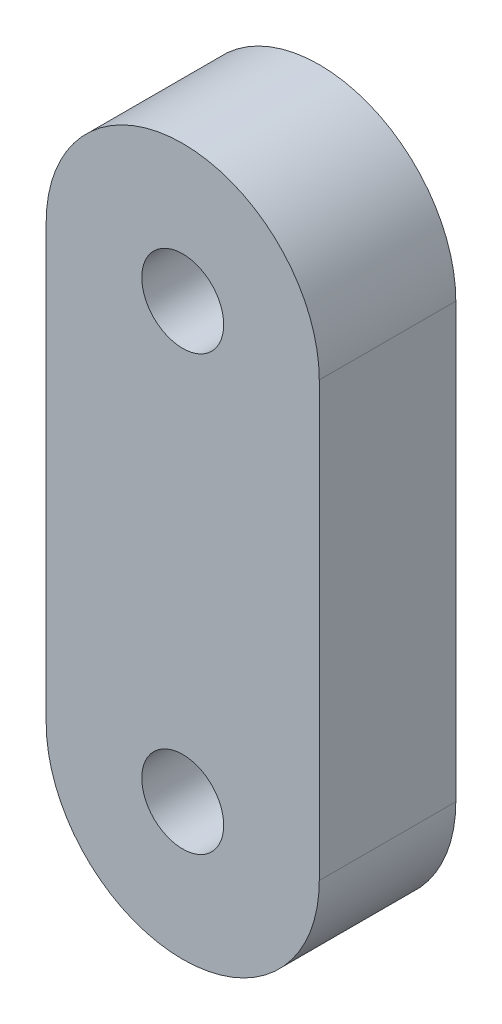
ISO-10303-21;
HEADER;
FILE_DESCRIPTION(('STEP AP214'),'2;1');
FILE_NAME('part.step','',(''),(''),'','','');
FILE_SCHEMA(('AUTOMOTIVE_DESIGN { 1 0 10303 214 1 1 1 1 }'));
ENDSEC;
DATA;
#1=APPLICATION_CONTEXT('core data for automotive mechanical design processes');
#2=APPLICATION_PROTOCOL_DEFINITION('international standard','automotive_design',2000,#1);
#3=PRODUCT_CONTEXT('',#1,'mechanical');
#4=PRODUCT('Part','Part','',(#3));
#5=PRODUCT_RELATED_PRODUCT_CATEGORY('part','',(#4));
#6=PRODUCT_DEFINITION_FORMATION('','',#4);
#7=PRODUCT_DEFINITION_CONTEXT('part definition',#1,'design');
#8=PRODUCT_DEFINITION('design','',#6,#7);
#9=PRODUCT_DEFINITION_SHAPE('','',#8);
#10=(LENGTH_UNIT() NAMED_UNIT(*) SI_UNIT(.MILLI.,.METRE.));
#11=(NAMED_UNIT(*) PLANE_ANGLE_UNIT() SI_UNIT($,.RADIAN.));
#12=(NAMED_UNIT(*) SI_UNIT($,.STERADIAN.) SOLID_ANGLE_UNIT());
#13=UNCERTAINTY_MEASURE_WITH_UNIT(LENGTH_MEASURE(1.E-05),#10,'distance_accuracy_value','');
#14=(GEOMETRIC_REPRESENTATION_CONTEXT(3) GLOBAL_UNCERTAINTY_ASSIGNED_CONTEXT((#13)) GLOBAL_UNIT_ASSIGNED_CONTEXT((#10,
#11,#12)) REPRESENTATION_CONTEXT('',''));
#15=CARTESIAN_POINT('',(0.,0.,0.));
#16=DIRECTION('',(0.,0.,1.));
#17=DIRECTION('',(1.,0.,0.));
#18=AXIS2_PLACEMENT_3D('',#15,#16,#17);
#19=CARTESIAN_POINT('',(0.,-6.35,4.));
#20=DIRECTION('',(0.,0.,1.));
#21=DIRECTION('',(1.,0.,0.));
#22=AXIS2_PLACEMENT_3D('',#19,#20,#21);
#23=PLANE('',#22);
#24=CARTESIAN_POINT('',(0.,6.35,4.));
#25=DIRECTION('',(0.,0.,1.));
#26=DIRECTION('',(1.,0.,0.));
#27=AXIS2_PLACEMENT_3D('',#24,#25,#26);
#28=CIRCLE('',#27,1.2);
#29=CARTESIAN_POINT('',(1.2,6.35,4.));
#30=VERTEX_POINT('',#29);
#31=EDGE_CURVE('E102',#30,#30,#28,.T.);
#32=ORIENTED_EDGE('',*,*,#31,.F.);
#33=EDGE_LOOP('',(#32));
#34=FACE_BOUND('',#33,.T.);
#35=CARTESIAN_POINT('',(0.,-6.35,4.));
#36=DIRECTION('',(0.,0.,1.));
#37=DIRECTION('',(1.,0.,0.));
#38=AXIS2_PLACEMENT_3D('',#35,#36,#37);
#39=CIRCLE('',#38,4.);
#40=CARTESIAN_POINT('',(-4.,-6.35,4.));
#41=VERTEX_POINT('',#40);
#42=CARTESIAN_POINT('',(4.,-6.35,4.));
#43=VERTEX_POINT('',#42);
#44=EDGE_CURVE('E87',#41,#43,#39,.T.);
#45=ORIENTED_EDGE('',*,*,#44,.T.);
#46=DIRECTION('',(0.,1.,0.));
#47=VECTOR('',#46,1.);
#48=CARTESIAN_POINT('',(4.,-6.35,4.));
#49=LINE('',#48,#47);
#50=CARTESIAN_POINT('',(4.,6.35,4.));
#51=VERTEX_POINT('',#50);
#52=EDGE_CURVE('E82',#43,#51,#49,.T.);
#53=ORIENTED_EDGE('',*,*,#52,.T.);
#54=CARTESIAN_POINT('',(0.,6.35,4.));
#55=DIRECTION('',(0.,0.,1.));
#56=DIRECTION('',(1.,0.,0.));
#57=AXIS2_PLACEMENT_3D('',#54,#55,#56);
#58=CIRCLE('',#57,4.);
#59=CARTESIAN_POINT('',(-4.,6.35,4.));
#60=VERTEX_POINT('',#59);
#61=EDGE_CURVE('E85',#51,#60,#58,.T.);
#62=ORIENTED_EDGE('',*,*,#61,.T.);
#63=DIRECTION('',(0.,-1.,0.));
#64=VECTOR('',#63,1.);
#65=CARTESIAN_POINT('',(-4.,-6.35,4.));
#66=LINE('',#65,#64);
#67=EDGE_CURVE('E52',#60,#41,#66,.T.);
#68=ORIENTED_EDGE('',*,*,#67,.T.);
#69=EDGE_LOOP('',(#45,#53,#62,#68));
#70=FACE_BOUND('',#69,.T.);
#71=CARTESIAN_POINT('',(0.,-6.35,4.));
#72=DIRECTION('',(0.,0.,1.));
#73=DIRECTION('',(1.,0.,0.));
#74=AXIS2_PLACEMENT_3D('',#71,#72,#73);
#75=CIRCLE('',#74,1.2);
#76=CARTESIAN_POINT('',(1.2,-6.35,4.));
#77=VERTEX_POINT('',#76);
#78=EDGE_CURVE('E117',#77,#77,#75,.T.);
#79=ORIENTED_EDGE('',*,*,#78,.F.);
#80=EDGE_LOOP('',(#79));
#81=FACE_BOUND('',#80,.T.);
#82=ADVANCED_FACE('F35',(#34,#70,#81),#23,.T.);
#83=CARTESIAN_POINT('',(0.,-6.35,0.));
#84=DIRECTION('',(0.,0.,1.));
#85=DIRECTION('',(1.,0.,0.));
#86=AXIS2_PLACEMENT_3D('',#83,#84,#85);
#87=PLANE('',#86);
#88=CARTESIAN_POINT('',(0.,-6.35,0.));
#89=DIRECTION('',(0.,0.,1.));
#90=DIRECTION('',(1.,0.,0.));
#91=AXIS2_PLACEMENT_3D('',#88,#89,#90);
#92=CIRCLE('',#91,4.);
#93=CARTESIAN_POINT('',(-4.,-6.35,0.));
#94=VERTEX_POINT('',#93);
#95=CARTESIAN_POINT('',(4.,-6.35,0.));
#96=VERTEX_POINT('',#95);
#97=EDGE_CURVE('E99',#94,#96,#92,.T.);
#98=ORIENTED_EDGE('',*,*,#97,.F.);
#99=DIRECTION('',(0.,-1.,0.));
#100=VECTOR('',#99,1.);
#101=CARTESIAN_POINT('',(-4.,-6.35,0.));
#102=LINE('',#101,#100);
#103=CARTESIAN_POINT('',(-4.,6.35,0.));
#104=VERTEX_POINT('',#103);
#105=EDGE_CURVE('E75',#104,#94,#102,.T.);
#106=ORIENTED_EDGE('',*,*,#105,.F.);
#107=CARTESIAN_POINT('',(0.,6.35,0.));
#108=DIRECTION('',(0.,0.,1.));
#109=DIRECTION('',(1.,0.,0.));
#110=AXIS2_PLACEMENT_3D('',#107,#108,#109);
#111=CIRCLE('',#110,4.);
#112=CARTESIAN_POINT('',(4.,6.35,0.));
#113=VERTEX_POINT('',#112);
#114=EDGE_CURVE('E69',#113,#104,#111,.T.);
#115=ORIENTED_EDGE('',*,*,#114,.F.);
#116=DIRECTION('',(0.,1.,0.));
#117=VECTOR('',#116,1.);
#118=CARTESIAN_POINT('',(4.,-6.35,0.));
#119=LINE('',#118,#117);
#120=EDGE_CURVE('E91',#96,#113,#119,.T.);
#121=ORIENTED_EDGE('',*,*,#120,.F.);
#122=EDGE_LOOP('',(#98,#106,#115,#121));
#123=FACE_BOUND('',#122,.T.);
#124=CARTESIAN_POINT('',(0.,6.35,0.));
#125=DIRECTION('',(0.,0.,1.));
#126=DIRECTION('',(1.,0.,0.));
#127=AXIS2_PLACEMENT_3D('',#124,#125,#126);
#128=CIRCLE('',#127,1.2);
#129=CARTESIAN_POINT('',(1.2,6.35,0.));
#130=VERTEX_POINT('',#129);
#131=EDGE_CURVE('E114',#130,#130,#128,.T.);
#132=ORIENTED_EDGE('',*,*,#131,.T.);
#133=EDGE_LOOP('',(#132));
#134=FACE_BOUND('',#133,.T.);
#135=CARTESIAN_POINT('',(0.,-6.35,0.));
#136=DIRECTION('',(0.,0.,1.));
#137=DIRECTION('',(1.,0.,0.));
#138=AXIS2_PLACEMENT_3D('',#135,#136,#137);
#139=CIRCLE('',#138,1.2);
#140=CARTESIAN_POINT('',(1.2,-6.35,0.));
#141=VERTEX_POINT('',#140);
#142=EDGE_CURVE('E120',#141,#141,#139,.T.);
#143=ORIENTED_EDGE('',*,*,#142,.T.);
#144=EDGE_LOOP('',(#143));
#145=FACE_BOUND('',#144,.T.);
#146=ADVANCED_FACE('F110',(#123,#134,#145),#87,.F.);
#147=CARTESIAN_POINT('',(0.,-6.35,4.));
#148=DIRECTION('',(0.,0.,-1.));
#149=DIRECTION('',(-1.,0.,0.));
#150=AXIS2_PLACEMENT_3D('',#147,#148,#149);
#151=CYLINDRICAL_SURFACE('',#150,4.);
#152=ORIENTED_EDGE('',*,*,#97,.T.);
#153=DIRECTION('',(0.,0.,-1.));
#154=VECTOR('',#153,1.);
#155=CARTESIAN_POINT('',(4.,-6.35,4.));
#156=LINE('',#155,#154);
#157=EDGE_CURVE('E11',#43,#96,#156,.T.);
#158=ORIENTED_EDGE('',*,*,#157,.F.);
#159=ORIENTED_EDGE('',*,*,#44,.F.);
#160=DIRECTION('',(0.,0.,-1.));
#161=VECTOR('',#160,1.);
#162=CARTESIAN_POINT('',(-4.,-6.35,4.));
#163=LINE('',#162,#161);
#164=EDGE_CURVE('E95',#41,#94,#163,.T.);
#165=ORIENTED_EDGE('',*,*,#164,.T.);
#166=EDGE_LOOP('',(#152,#158,#159,#165));
#167=FACE_BOUND('',#166,.T.);
#168=ADVANCED_FACE('F37',(#167),#151,.T.);
#169=CARTESIAN_POINT('',(4.,-6.35,4.));
#170=DIRECTION('',(-1.,0.,0.));
#171=DIRECTION('',(0.,-1.,0.));
#172=AXIS2_PLACEMENT_3D('',#169,#170,#171);
#173=PLANE('',#172);
#174=ORIENTED_EDGE('',*,*,#120,.T.);
#175=DIRECTION('',(0.,0.,-1.));
#176=VECTOR('',#175,1.);
#177=CARTESIAN_POINT('',(4.,6.35,4.));
#178=LINE('',#177,#176);
#179=EDGE_CURVE('E44',#51,#113,#178,.T.);
#180=ORIENTED_EDGE('',*,*,#179,.F.);
#181=ORIENTED_EDGE('',*,*,#52,.F.);
#182=ORIENTED_EDGE('',*,*,#157,.T.);
#183=EDGE_LOOP('',(#174,#180,#181,#182));
#184=FACE_BOUND('',#183,.T.);
#185=ADVANCED_FACE('F90',(#184),#173,.F.);
#186=CARTESIAN_POINT('',(0.,6.35,4.));
#187=DIRECTION('',(0.,0.,-1.));
#188=DIRECTION('',(-1.,0.,0.));
#189=AXIS2_PLACEMENT_3D('',#186,#187,#188);
#190=CYLINDRICAL_SURFACE('',#189,4.);
#191=ORIENTED_EDGE('',*,*,#114,.T.);
#192=DIRECTION('',(0.,0.,-1.));
#193=VECTOR('',#192,1.);
#194=CARTESIAN_POINT('',(-4.,6.35,4.));
#195=LINE('',#194,#193);
#196=EDGE_CURVE('E92',#60,#104,#195,.T.);
#197=ORIENTED_EDGE('',*,*,#196,.F.);
#198=ORIENTED_EDGE('',*,*,#61,.F.);
#199=ORIENTED_EDGE('',*,*,#179,.T.);
#200=EDGE_LOOP('',(#191,#197,#198,#199));
#201=FACE_BOUND('',#200,.T.);
#202=ADVANCED_FACE('F93',(#201),#190,.T.);
#203=CARTESIAN_POINT('',(-4.,-6.35,4.));
#204=DIRECTION('',(1.,0.,0.));
#205=DIRECTION('',(0.,1.,0.));
#206=AXIS2_PLACEMENT_3D('',#203,#204,#205);
#207=PLANE('',#206);
#208=ORIENTED_EDGE('',*,*,#105,.T.);
#209=ORIENTED_EDGE('',*,*,#164,.F.);
#210=ORIENTED_EDGE('',*,*,#67,.F.);
#211=ORIENTED_EDGE('',*,*,#196,.T.);
#212=EDGE_LOOP('',(#208,#209,#210,#211));
#213=FACE_BOUND('',#212,.T.);
#214=ADVANCED_FACE('F107',(#213),#207,.F.);
#215=CARTESIAN_POINT('',(0.,6.35,4.));
#216=DIRECTION('',(0.,0.,-1.));
#217=DIRECTION('',(-1.,0.,0.));
#218=AXIS2_PLACEMENT_3D('',#215,#216,#217);
#219=CYLINDRICAL_SURFACE('',#218,1.2);
#220=ORIENTED_EDGE('',*,*,#31,.T.);
#221=EDGE_LOOP('',(#220));
#222=FACE_BOUND('',#221,.T.);
#223=ORIENTED_EDGE('',*,*,#131,.F.);
#224=EDGE_LOOP('',(#223));
#225=FACE_BOUND('',#224,.T.);
#226=ADVANCED_FACE('F137',(#222,#225),#219,.F.);
#227=CARTESIAN_POINT('',(0.,-6.35,4.));
#228=DIRECTION('',(0.,0.,-1.));
#229=DIRECTION('',(-1.,0.,0.));
#230=AXIS2_PLACEMENT_3D('',#227,#228,#229);
#231=CYLINDRICAL_SURFACE('',#230,1.2);
#232=ORIENTED_EDGE('',*,*,#78,.T.);
#233=EDGE_LOOP('',(#232));
#234=FACE_BOUND('',#233,.T.);
#235=ORIENTED_EDGE('',*,*,#142,.F.);
#236=EDGE_LOOP('',(#235));
#237=FACE_BOUND('',#236,.T.);
#238=ADVANCED_FACE('F126',(#234,#237),#231,.F.);
#239=CLOSED_SHELL('',(#82,#146,#168,#185,#202,#214,#226,#238));
#240=MANIFOLD_SOLID_BREP('B2',#239);
#241=ADVANCED_BREP_SHAPE_REPRESENTATION('',(#18,#240),#14);
#242=SHAPE_DEFINITION_REPRESENTATION(#9,#241);
ENDSEC;
END-ISO-10303-21;
